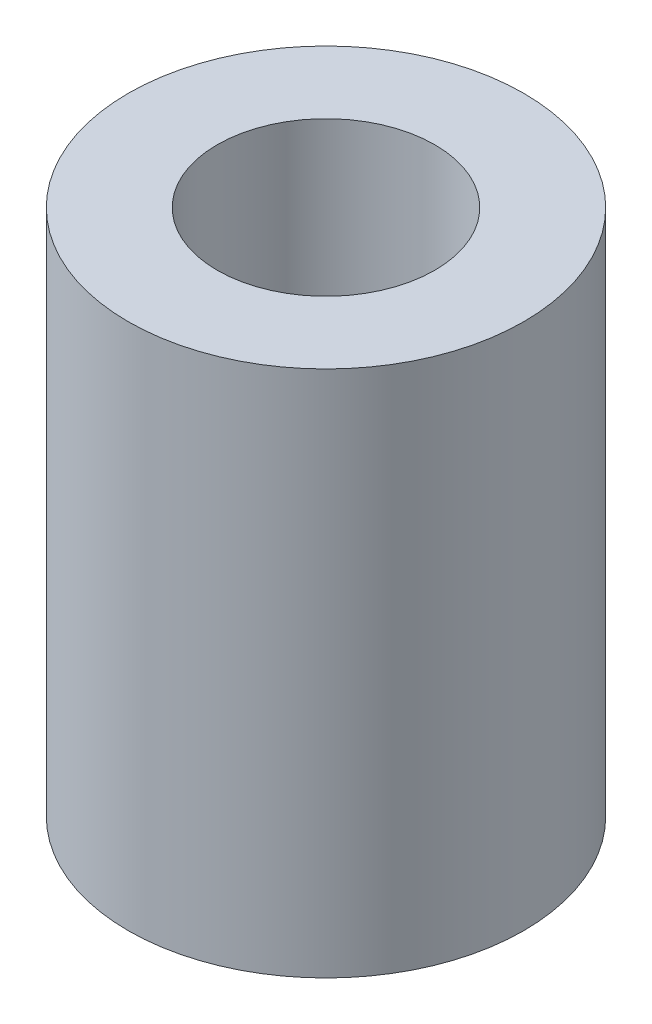
ISO-10303-21;
HEADER;
FILE_DESCRIPTION(('STEP AP214'),'2;1');
FILE_NAME('part.step','',(''),(''),'','','');
FILE_SCHEMA(('AUTOMOTIVE_DESIGN { 1 0 10303 214 1 1 1 1 }'));
ENDSEC;
DATA;
#1=APPLICATION_CONTEXT('core data for automotive mechanical design processes');
#2=APPLICATION_PROTOCOL_DEFINITION('international standard','automotive_design',2000,#1);
#3=PRODUCT_CONTEXT('',#1,'mechanical');
#4=PRODUCT('Part','Part','',(#3));
#5=PRODUCT_RELATED_PRODUCT_CATEGORY('part','',(#4));
#6=PRODUCT_DEFINITION_FORMATION('','',#4);
#7=PRODUCT_DEFINITION_CONTEXT('part definition',#1,'design');
#8=PRODUCT_DEFINITION('design','',#6,#7);
#9=PRODUCT_DEFINITION_SHAPE('','',#8);
#10=(LENGTH_UNIT() NAMED_UNIT(*) SI_UNIT(.MILLI.,.METRE.));
#11=(NAMED_UNIT(*) PLANE_ANGLE_UNIT() SI_UNIT($,.RADIAN.));
#12=(NAMED_UNIT(*) SI_UNIT($,.STERADIAN.) SOLID_ANGLE_UNIT());
#13=UNCERTAINTY_MEASURE_WITH_UNIT(LENGTH_MEASURE(1.E-05),#10,'distance_accuracy_value','');
#14=(GEOMETRIC_REPRESENTATION_CONTEXT(3) GLOBAL_UNCERTAINTY_ASSIGNED_CONTEXT((#13)) GLOBAL_UNIT_ASSIGNED_CONTEXT((#10,
#11,#12)) REPRESENTATION_CONTEXT('',''));
#15=CARTESIAN_POINT('',(0.,0.,0.));
#16=DIRECTION('',(0.,0.,1.));
#17=DIRECTION('',(1.,0.,0.));
#18=AXIS2_PLACEMENT_3D('',#15,#16,#17);
#19=CARTESIAN_POINT('',(0.,8.,0.));
#20=DIRECTION('',(0.,1.,0.));
#21=DIRECTION('',(0.,0.,1.));
#22=AXIS2_PLACEMENT_3D('',#19,#20,#21);
#23=PLANE('',#22);
#24=CARTESIAN_POINT('',(0.,8.,0.));
#25=DIRECTION('',(0.,1.,0.));
#26=DIRECTION('',(0.,0.,1.));
#27=AXIS2_PLACEMENT_3D('',#24,#25,#26);
#28=CIRCLE('',#27,3.);
#29=CARTESIAN_POINT('',(0.,8.,3.));
#30=VERTEX_POINT('',#29);
#31=EDGE_CURVE('E10',#30,#30,#28,.T.);
#32=ORIENTED_EDGE('',*,*,#31,.T.);
#33=EDGE_LOOP('',(#32));
#34=FACE_BOUND('',#33,.T.);
#35=CARTESIAN_POINT('',(0.,8.,0.));
#36=DIRECTION('',(0.,1.,0.));
#37=DIRECTION('',(0.,0.,1.));
#38=AXIS2_PLACEMENT_3D('',#35,#36,#37);
#39=CIRCLE('',#38,1.65);
#40=CARTESIAN_POINT('',(0.,8.,1.65));
#41=VERTEX_POINT('',#40);
#42=EDGE_CURVE('E57',#41,#41,#39,.T.);
#43=ORIENTED_EDGE('',*,*,#42,.F.);
#44=EDGE_LOOP('',(#43));
#45=FACE_BOUND('',#44,.T.);
#46=ADVANCED_FACE('F43',(#34,#45),#23,.T.);
#47=CARTESIAN_POINT('',(0.,0.,0.));
#48=DIRECTION('',(0.,1.,0.));
#49=DIRECTION('',(0.,0.,1.));
#50=AXIS2_PLACEMENT_3D('',#47,#48,#49);
#51=PLANE('',#50);
#52=CARTESIAN_POINT('',(0.,0.,0.));
#53=DIRECTION('',(0.,1.,0.));
#54=DIRECTION('',(0.,0.,1.));
#55=AXIS2_PLACEMENT_3D('',#52,#53,#54);
#56=CIRCLE('',#55,3.);
#57=CARTESIAN_POINT('',(0.,0.,3.));
#58=VERTEX_POINT('',#57);
#59=EDGE_CURVE('E50',#58,#58,#56,.T.);
#60=ORIENTED_EDGE('',*,*,#59,.F.);
#61=EDGE_LOOP('',(#60));
#62=FACE_BOUND('',#61,.T.);
#63=CARTESIAN_POINT('',(0.,0.,0.));
#64=DIRECTION('',(0.,1.,0.));
#65=DIRECTION('',(0.,0.,1.));
#66=AXIS2_PLACEMENT_3D('',#63,#64,#65);
#67=CIRCLE('',#66,1.65);
#68=CARTESIAN_POINT('',(0.,0.,1.65));
#69=VERTEX_POINT('',#68);
#70=EDGE_CURVE('E59',#69,#69,#67,.T.);
#71=ORIENTED_EDGE('',*,*,#70,.T.);
#72=EDGE_LOOP('',(#71));
#73=FACE_BOUND('',#72,.T.);
#74=ADVANCED_FACE('F68',(#62,#73),#51,.F.);
#75=CARTESIAN_POINT('',(0.,8.,0.));
#76=DIRECTION('',(0.,-1.,0.));
#77=DIRECTION('',(0.,0.,-1.));
#78=AXIS2_PLACEMENT_3D('',#75,#76,#77);
#79=CYLINDRICAL_SURFACE('',#78,3.);
#80=ORIENTED_EDGE('',*,*,#31,.F.);
#81=EDGE_LOOP('',(#80));
#82=FACE_BOUND('',#81,.T.);
#83=ORIENTED_EDGE('',*,*,#59,.T.);
#84=EDGE_LOOP('',(#83));
#85=FACE_BOUND('',#84,.T.);
#86=ADVANCED_FACE('F44',(#82,#85),#79,.T.);
#87=CARTESIAN_POINT('',(0.,8.,0.));
#88=DIRECTION('',(0.,-1.,0.));
#89=DIRECTION('',(0.,0.,-1.));
#90=AXIS2_PLACEMENT_3D('',#87,#88,#89);
#91=CYLINDRICAL_SURFACE('',#90,1.65);
#92=ORIENTED_EDGE('',*,*,#42,.T.);
#93=EDGE_LOOP('',(#92));
#94=FACE_BOUND('',#93,.T.);
#95=ORIENTED_EDGE('',*,*,#70,.F.);
#96=EDGE_LOOP('',(#95));
#97=FACE_BOUND('',#96,.T.);
#98=ADVANCED_FACE('F67',(#94,#97),#91,.F.);
#99=CLOSED_SHELL('',(#46,#74,#86,#98));
#100=MANIFOLD_SOLID_BREP('B2',#99);
#101=ADVANCED_BREP_SHAPE_REPRESENTATION('',(#18,#100),#14);
#102=SHAPE_DEFINITION_REPRESENTATION(#9,#101);
ENDSEC;
END-ISO-10303-21;
